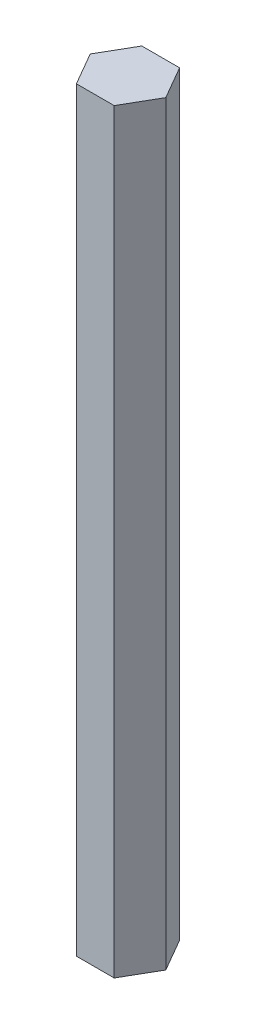
ISO-10303-21;
HEADER;
FILE_DESCRIPTION(('STEP AP214'),'2;1');
FILE_NAME('part.step','',(''),(''),'','','');
FILE_SCHEMA(('AUTOMOTIVE_DESIGN { 1 0 10303 214 1 1 1 1 }'));
ENDSEC;
DATA;
#1=APPLICATION_CONTEXT('core data for automotive mechanical design processes');
#2=APPLICATION_PROTOCOL_DEFINITION('international standard','automotive_design',2000,#1);
#3=PRODUCT_CONTEXT('',#1,'mechanical');
#4=PRODUCT('Part','Part','',(#3));
#5=PRODUCT_RELATED_PRODUCT_CATEGORY('part','',(#4));
#6=PRODUCT_DEFINITION_FORMATION('','',#4);
#7=PRODUCT_DEFINITION_CONTEXT('part definition',#1,'design');
#8=PRODUCT_DEFINITION('design','',#6,#7);
#9=PRODUCT_DEFINITION_SHAPE('','',#8);
#10=(LENGTH_UNIT() NAMED_UNIT(*) SI_UNIT(.MILLI.,.METRE.));
#11=(NAMED_UNIT(*) PLANE_ANGLE_UNIT() SI_UNIT($,.RADIAN.));
#12=(NAMED_UNIT(*) SI_UNIT($,.STERADIAN.) SOLID_ANGLE_UNIT());
#13=UNCERTAINTY_MEASURE_WITH_UNIT(LENGTH_MEASURE(1.E-05),#10,'distance_accuracy_value','');
#14=(GEOMETRIC_REPRESENTATION_CONTEXT(3) GLOBAL_UNCERTAINTY_ASSIGNED_CONTEXT((#13)) GLOBAL_UNIT_ASSIGNED_CONTEXT((#10,
#11,#12)) REPRESENTATION_CONTEXT('',''));
#15=CARTESIAN_POINT('',(0.,0.,0.));
#16=DIRECTION('',(0.,0.,1.));
#17=DIRECTION('',(1.,0.,0.));
#18=AXIS2_PLACEMENT_3D('',#15,#16,#17);
#19=CARTESIAN_POINT('',(3.,60.,0.));
#20=DIRECTION('',(-0.866025403784439,0.,0.5));
#21=DIRECTION('',(0.5,0.,0.866025403784439));
#22=AXIS2_PLACEMENT_3D('',#19,#20,#21);
#23=PLANE('',#22);
#24=DIRECTION('',(-0.5,0.,-0.866025403784439));
#25=VECTOR('',#24,1.);
#26=CARTESIAN_POINT('',(3.,0.,0.));
#27=LINE('',#26,#25);
#28=CARTESIAN_POINT('',(3.,0.,0.));
#29=VERTEX_POINT('',#28);
#30=CARTESIAN_POINT('',(1.5,0.,-2.59807621135332));
#31=VERTEX_POINT('',#30);
#32=EDGE_CURVE('E116',#29,#31,#27,.T.);
#33=ORIENTED_EDGE('',*,*,#32,.T.);
#34=DIRECTION('',(0.,-1.,0.));
#35=VECTOR('',#34,1.);
#36=CARTESIAN_POINT('',(1.5,60.,-2.59807621135332));
#37=LINE('',#36,#35);
#38=CARTESIAN_POINT('',(1.5,60.,-2.59807621135332));
#39=VERTEX_POINT('',#38);
#40=EDGE_CURVE('E11',#39,#31,#37,.T.);
#41=ORIENTED_EDGE('',*,*,#40,.F.);
#42=DIRECTION('',(-0.5,0.,-0.866025403784439));
#43=VECTOR('',#42,1.);
#44=CARTESIAN_POINT('',(3.,60.,0.));
#45=LINE('',#44,#43);
#46=CARTESIAN_POINT('',(3.,60.,0.));
#47=VERTEX_POINT('',#46);
#48=EDGE_CURVE('E126',#47,#39,#45,.T.);
#49=ORIENTED_EDGE('',*,*,#48,.F.);
#50=DIRECTION('',(0.,-1.,0.));
#51=VECTOR('',#50,1.);
#52=CARTESIAN_POINT('',(3.,60.,0.));
#53=LINE('',#52,#51);
#54=EDGE_CURVE('E112',#47,#29,#53,.T.);
#55=ORIENTED_EDGE('',*,*,#54,.T.);
#56=EDGE_LOOP('',(#33,#41,#49,#55));
#57=FACE_BOUND('',#56,.T.);
#58=ADVANCED_FACE('F32',(#57),#23,.F.);
#59=CARTESIAN_POINT('',(1.5,60.,-2.59807621135332));
#60=DIRECTION('',(0.,0.,1.));
#61=DIRECTION('',(1.,0.,0.));
#62=AXIS2_PLACEMENT_3D('',#59,#60,#61);
#63=PLANE('',#62);
#64=DIRECTION('',(-1.,0.,0.));
#65=VECTOR('',#64,1.);
#66=CARTESIAN_POINT('',(1.5,0.,-2.59807621135332));
#67=LINE('',#66,#65);
#68=CARTESIAN_POINT('',(-1.5,0.,-2.59807621135332));
#69=VERTEX_POINT('',#68);
#70=EDGE_CURVE('E119',#31,#69,#67,.T.);
#71=ORIENTED_EDGE('',*,*,#70,.T.);
#72=DIRECTION('',(0.,-1.,0.));
#73=VECTOR('',#72,1.);
#74=CARTESIAN_POINT('',(-1.5,60.,-2.59807621135332));
#75=LINE('',#74,#73);
#76=CARTESIAN_POINT('',(-1.5,60.,-2.59807621135332));
#77=VERTEX_POINT('',#76);
#78=EDGE_CURVE('E40',#77,#69,#75,.T.);
#79=ORIENTED_EDGE('',*,*,#78,.F.);
#80=DIRECTION('',(-1.,0.,0.));
#81=VECTOR('',#80,1.);
#82=CARTESIAN_POINT('',(1.5,60.,-2.59807621135332));
#83=LINE('',#82,#81);
#84=EDGE_CURVE('E85',#39,#77,#83,.T.);
#85=ORIENTED_EDGE('',*,*,#84,.F.);
#86=ORIENTED_EDGE('',*,*,#40,.T.);
#87=EDGE_LOOP('',(#71,#79,#85,#86));
#88=FACE_BOUND('',#87,.T.);
#89=ADVANCED_FACE('F150',(#88),#63,.F.);
#90=CARTESIAN_POINT('',(-1.5,60.,-2.59807621135332));
#91=DIRECTION('',(0.866025403784439,0.,0.5));
#92=DIRECTION('',(0.5,0.,-0.866025403784439));
#93=AXIS2_PLACEMENT_3D('',#90,#91,#92);
#94=PLANE('',#93);
#95=DIRECTION('',(-0.5,0.,0.866025403784439));
#96=VECTOR('',#95,1.);
#97=CARTESIAN_POINT('',(-1.5,0.,-2.59807621135332));
#98=LINE('',#97,#96);
#99=CARTESIAN_POINT('',(-3.,0.,0.));
#100=VERTEX_POINT('',#99);
#101=EDGE_CURVE('E121',#69,#100,#98,.T.);
#102=ORIENTED_EDGE('',*,*,#101,.T.);
#103=DIRECTION('',(0.,-1.,0.));
#104=VECTOR('',#103,1.);
#105=CARTESIAN_POINT('',(-3.,60.,0.));
#106=LINE('',#105,#104);
#107=CARTESIAN_POINT('',(-3.,60.,0.));
#108=VERTEX_POINT('',#107);
#109=EDGE_CURVE('E107',#108,#100,#106,.T.);
#110=ORIENTED_EDGE('',*,*,#109,.F.);
#111=DIRECTION('',(-0.5,0.,0.866025403784439));
#112=VECTOR('',#111,1.);
#113=CARTESIAN_POINT('',(-1.5,60.,-2.59807621135332));
#114=LINE('',#113,#112);
#115=EDGE_CURVE('E98',#77,#108,#114,.T.);
#116=ORIENTED_EDGE('',*,*,#115,.F.);
#117=ORIENTED_EDGE('',*,*,#78,.T.);
#118=EDGE_LOOP('',(#102,#110,#116,#117));
#119=FACE_BOUND('',#118,.T.);
#120=ADVANCED_FACE('F132',(#119),#94,.F.);
#121=CARTESIAN_POINT('',(-3.,60.,0.));
#122=DIRECTION('',(0.866025403784439,0.,-0.5));
#123=DIRECTION('',(-0.5,0.,-0.866025403784439));
#124=AXIS2_PLACEMENT_3D('',#121,#122,#123);
#125=PLANE('',#124);
#126=DIRECTION('',(0.5,0.,0.866025403784439));
#127=VECTOR('',#126,1.);
#128=CARTESIAN_POINT('',(-3.,0.,0.));
#129=LINE('',#128,#127);
#130=CARTESIAN_POINT('',(-1.5,0.,2.59807621135332));
#131=VERTEX_POINT('',#130);
#132=EDGE_CURVE('E106',#100,#131,#129,.T.);
#133=ORIENTED_EDGE('',*,*,#132,.T.);
#134=DIRECTION('',(0.,-1.,0.));
#135=VECTOR('',#134,1.);
#136=CARTESIAN_POINT('',(-1.5,60.,2.59807621135332));
#137=LINE('',#136,#135);
#138=CARTESIAN_POINT('',(-1.5,60.,2.59807621135332));
#139=VERTEX_POINT('',#138);
#140=EDGE_CURVE('E103',#139,#131,#137,.T.);
#141=ORIENTED_EDGE('',*,*,#140,.F.);
#142=DIRECTION('',(0.5,0.,0.866025403784439));
#143=VECTOR('',#142,1.);
#144=CARTESIAN_POINT('',(-3.,60.,0.));
#145=LINE('',#144,#143);
#146=EDGE_CURVE('E92',#108,#139,#145,.T.);
#147=ORIENTED_EDGE('',*,*,#146,.F.);
#148=ORIENTED_EDGE('',*,*,#109,.T.);
#149=EDGE_LOOP('',(#133,#141,#147,#148));
#150=FACE_BOUND('',#149,.T.);
#151=ADVANCED_FACE('F104',(#150),#125,.F.);
#152=CARTESIAN_POINT('',(-1.5,60.,2.59807621135332));
#153=DIRECTION('',(0.,0.,-1.));
#154=DIRECTION('',(-1.,0.,0.));
#155=AXIS2_PLACEMENT_3D('',#152,#153,#154);
#156=PLANE('',#155);
#157=DIRECTION('',(1.,0.,0.));
#158=VECTOR('',#157,1.);
#159=CARTESIAN_POINT('',(-1.5,0.,2.59807621135332));
#160=LINE('',#159,#158);
#161=CARTESIAN_POINT('',(1.5,0.,2.59807621135332));
#162=VERTEX_POINT('',#161);
#163=EDGE_CURVE('E71',#131,#162,#160,.T.);
#164=ORIENTED_EDGE('',*,*,#163,.T.);
#165=DIRECTION('',(0.,-1.,0.));
#166=VECTOR('',#165,1.);
#167=CARTESIAN_POINT('',(1.5,60.,2.59807621135332));
#168=LINE('',#167,#166);
#169=CARTESIAN_POINT('',(1.5,60.,2.59807621135332));
#170=VERTEX_POINT('',#169);
#171=EDGE_CURVE('E108',#170,#162,#168,.T.);
#172=ORIENTED_EDGE('',*,*,#171,.F.);
#173=DIRECTION('',(1.,0.,0.));
#174=VECTOR('',#173,1.);
#175=CARTESIAN_POINT('',(-1.5,60.,2.59807621135332));
#176=LINE('',#175,#174);
#177=EDGE_CURVE('E96',#139,#170,#176,.T.);
#178=ORIENTED_EDGE('',*,*,#177,.F.);
#179=ORIENTED_EDGE('',*,*,#140,.T.);
#180=EDGE_LOOP('',(#164,#172,#178,#179));
#181=FACE_BOUND('',#180,.T.);
#182=ADVANCED_FACE('F110',(#181),#156,.F.);
#183=CARTESIAN_POINT('',(1.5,60.,2.59807621135332));
#184=DIRECTION('',(-0.866025403784439,0.,-0.5));
#185=DIRECTION('',(-0.5,0.,0.866025403784439));
#186=AXIS2_PLACEMENT_3D('',#183,#184,#185);
#187=PLANE('',#186);
#188=DIRECTION('',(0.5,0.,-0.866025403784438));
#189=VECTOR('',#188,1.);
#190=CARTESIAN_POINT('',(1.5,0.,2.59807621135332));
#191=LINE('',#190,#189);
#192=EDGE_CURVE('E77',#162,#29,#191,.T.);
#193=ORIENTED_EDGE('',*,*,#192,.T.);
#194=ORIENTED_EDGE('',*,*,#54,.F.);
#195=DIRECTION('',(0.5,0.,-0.866025403784438));
#196=VECTOR('',#195,1.);
#197=CARTESIAN_POINT('',(1.5,60.,2.59807621135332));
#198=LINE('',#197,#196);
#199=EDGE_CURVE('E48',#170,#47,#198,.T.);
#200=ORIENTED_EDGE('',*,*,#199,.F.);
#201=ORIENTED_EDGE('',*,*,#171,.T.);
#202=EDGE_LOOP('',(#193,#194,#200,#201));
#203=FACE_BOUND('',#202,.T.);
#204=ADVANCED_FACE('F139',(#203),#187,.F.);
#205=CARTESIAN_POINT('',(0.,60.,0.));
#206=DIRECTION('',(0.,1.,0.));
#207=DIRECTION('',(0.,0.,1.));
#208=AXIS2_PLACEMENT_3D('',#205,#206,#207);
#209=PLANE('',#208);
#210=ORIENTED_EDGE('',*,*,#48,.T.);
#211=ORIENTED_EDGE('',*,*,#84,.T.);
#212=ORIENTED_EDGE('',*,*,#115,.T.);
#213=ORIENTED_EDGE('',*,*,#146,.T.);
#214=ORIENTED_EDGE('',*,*,#177,.T.);
#215=ORIENTED_EDGE('',*,*,#199,.T.);
#216=EDGE_LOOP('',(#210,#211,#212,#213,#214,#215));
#217=FACE_BOUND('',#216,.T.);
#218=ADVANCED_FACE('F94',(#217),#209,.T.);
#219=CARTESIAN_POINT('',(0.,0.,0.));
#220=DIRECTION('',(0.,1.,0.));
#221=DIRECTION('',(0.,0.,1.));
#222=AXIS2_PLACEMENT_3D('',#219,#220,#221);
#223=PLANE('',#222);
#224=ORIENTED_EDGE('',*,*,#32,.F.);
#225=ORIENTED_EDGE('',*,*,#192,.F.);
#226=ORIENTED_EDGE('',*,*,#163,.F.);
#227=ORIENTED_EDGE('',*,*,#132,.F.);
#228=ORIENTED_EDGE('',*,*,#101,.F.);
#229=ORIENTED_EDGE('',*,*,#70,.F.);
#230=EDGE_LOOP('',(#224,#225,#226,#227,#228,#229));
#231=FACE_BOUND('',#230,.T.);
#232=ADVANCED_FACE('F135',(#231),#223,.F.);
#233=CLOSED_SHELL('',(#58,#89,#120,#151,#182,#204,#218,#232));
#234=MANIFOLD_SOLID_BREP('B2',#233);
#235=ADVANCED_BREP_SHAPE_REPRESENTATION('',(#18,#234),#14);
#236=SHAPE_DEFINITION_REPRESENTATION(#9,#235);
ENDSEC;
END-ISO-10303-21;
